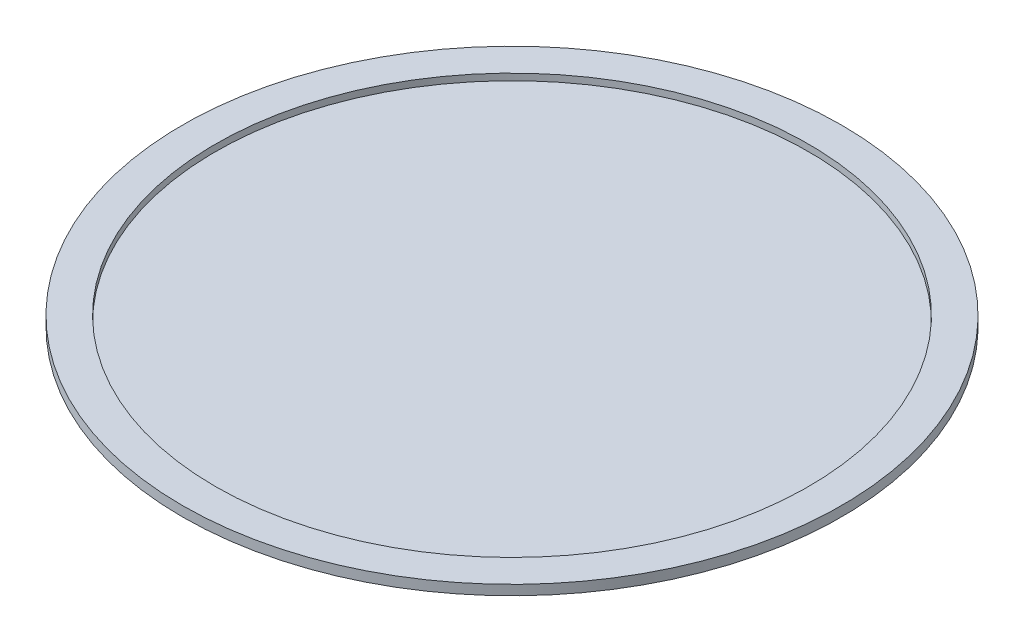
ISO-10303-21;
HEADER;
FILE_DESCRIPTION(('STEP AP214'),'2;1');
FILE_NAME('part.step','',(''),(''),'','','');
FILE_SCHEMA(('AUTOMOTIVE_DESIGN { 1 0 10303 214 1 1 1 1 }'));
ENDSEC;
DATA;
#1=APPLICATION_CONTEXT('core data for automotive mechanical design processes');
#2=APPLICATION_PROTOCOL_DEFINITION('international standard','automotive_design',2000,#1);
#3=PRODUCT_CONTEXT('',#1,'mechanical');
#4=PRODUCT('Part','Part','',(#3));
#5=PRODUCT_RELATED_PRODUCT_CATEGORY('part','',(#4));
#6=PRODUCT_DEFINITION_FORMATION('','',#4);
#7=PRODUCT_DEFINITION_CONTEXT('part definition',#1,'design');
#8=PRODUCT_DEFINITION('design','',#6,#7);
#9=PRODUCT_DEFINITION_SHAPE('','',#8);
#10=(LENGTH_UNIT() NAMED_UNIT(*) SI_UNIT(.MILLI.,.METRE.));
#11=(NAMED_UNIT(*) PLANE_ANGLE_UNIT() SI_UNIT($,.RADIAN.));
#12=(NAMED_UNIT(*) SI_UNIT($,.STERADIAN.) SOLID_ANGLE_UNIT());
#13=UNCERTAINTY_MEASURE_WITH_UNIT(LENGTH_MEASURE(1.E-05),#10,'distance_accuracy_value','');
#14=(GEOMETRIC_REPRESENTATION_CONTEXT(3) GLOBAL_UNCERTAINTY_ASSIGNED_CONTEXT((#13)) GLOBAL_UNIT_ASSIGNED_CONTEXT((#10,
#11,#12)) REPRESENTATION_CONTEXT('',''));
#15=CARTESIAN_POINT('',(0.,0.,0.));
#16=DIRECTION('',(0.,0.,1.));
#17=DIRECTION('',(1.,0.,0.));
#18=AXIS2_PLACEMENT_3D('',#15,#16,#17);
#19=CARTESIAN_POINT('',(0.,3.,0.));
#20=DIRECTION('',(0.,-1.,0.));
#21=DIRECTION('',(0.,0.,-1.));
#22=AXIS2_PLACEMENT_3D('',#19,#20,#21);
#23=CYLINDRICAL_SURFACE('',#22,100.);
#24=CARTESIAN_POINT('',(0.,3.,0.));
#25=DIRECTION('',(0.,1.,0.));
#26=DIRECTION('',(0.,0.,1.));
#27=AXIS2_PLACEMENT_3D('',#24,#25,#26);
#28=CIRCLE('',#27,100.);
#29=CARTESIAN_POINT('',(0.,3.,100.));
#30=VERTEX_POINT('',#29);
#31=EDGE_CURVE('E10',#30,#30,#28,.T.);
#32=ORIENTED_EDGE('',*,*,#31,.F.);
#33=EDGE_LOOP('',(#32));
#34=FACE_BOUND('',#33,.T.);
#35=CARTESIAN_POINT('',(0.,0.,0.));
#36=DIRECTION('',(0.,1.,0.));
#37=DIRECTION('',(0.,0.,1.));
#38=AXIS2_PLACEMENT_3D('',#35,#36,#37);
#39=CIRCLE('',#38,100.);
#40=CARTESIAN_POINT('',(0.,0.,100.));
#41=VERTEX_POINT('',#40);
#42=EDGE_CURVE('E34',#41,#41,#39,.T.);
#43=ORIENTED_EDGE('',*,*,#42,.T.);
#44=EDGE_LOOP('',(#43));
#45=FACE_BOUND('',#44,.T.);
#46=ADVANCED_FACE('F31',(#34,#45),#23,.T.);
#47=CARTESIAN_POINT('',(0.,3.,0.));
#48=DIRECTION('',(0.,1.,0.));
#49=DIRECTION('',(0.,0.,1.));
#50=AXIS2_PLACEMENT_3D('',#47,#48,#49);
#51=PLANE('',#50);
#52=CARTESIAN_POINT('',(0.,3.,0.));
#53=DIRECTION('',(0.,1.,0.));
#54=DIRECTION('',(0.,0.,1.));
#55=AXIS2_PLACEMENT_3D('',#52,#53,#54);
#56=CIRCLE('',#55,90.);
#57=CARTESIAN_POINT('',(0.,3.,90.));
#58=VERTEX_POINT('',#57);
#59=EDGE_CURVE('E43',#58,#58,#56,.T.);
#60=ORIENTED_EDGE('',*,*,#59,.F.);
#61=EDGE_LOOP('',(#60));
#62=FACE_BOUND('',#61,.T.);
#63=ORIENTED_EDGE('',*,*,#31,.T.);
#64=EDGE_LOOP('',(#63));
#65=FACE_BOUND('',#64,.T.);
#66=ADVANCED_FACE('F58',(#62,#65),#51,.T.);
#67=CARTESIAN_POINT('',(0.,0.,0.));
#68=DIRECTION('',(0.,1.,0.));
#69=DIRECTION('',(0.,0.,1.));
#70=AXIS2_PLACEMENT_3D('',#67,#68,#69);
#71=PLANE('',#70);
#72=ORIENTED_EDGE('',*,*,#42,.F.);
#73=EDGE_LOOP('',(#72));
#74=FACE_BOUND('',#73,.T.);
#75=ADVANCED_FACE('F54',(#74),#71,.F.);
#76=CARTESIAN_POINT('',(0.,1.,0.));
#77=DIRECTION('',(0.,1.,0.));
#78=DIRECTION('',(0.,0.,1.));
#79=AXIS2_PLACEMENT_3D('',#76,#77,#78);
#80=CYLINDRICAL_SURFACE('',#79,90.);
#81=CARTESIAN_POINT('',(0.,1.,0.));
#82=DIRECTION('',(0.,1.,0.));
#83=DIRECTION('',(0.,0.,1.));
#84=AXIS2_PLACEMENT_3D('',#81,#82,#83);
#85=CIRCLE('',#84,90.);
#86=CARTESIAN_POINT('',(0.,1.,90.));
#87=VERTEX_POINT('',#86);
#88=EDGE_CURVE('E41',#87,#87,#85,.T.);
#89=ORIENTED_EDGE('',*,*,#88,.F.);
#90=EDGE_LOOP('',(#89));
#91=FACE_BOUND('',#90,.T.);
#92=ORIENTED_EDGE('',*,*,#59,.T.);
#93=EDGE_LOOP('',(#92));
#94=FACE_BOUND('',#93,.T.);
#95=ADVANCED_FACE('F51',(#91,#94),#80,.F.);
#96=CARTESIAN_POINT('',(0.,1.,0.));
#97=DIRECTION('',(0.,1.,0.));
#98=DIRECTION('',(0.,0.,1.));
#99=AXIS2_PLACEMENT_3D('',#96,#97,#98);
#100=PLANE('',#99);
#101=ORIENTED_EDGE('',*,*,#88,.T.);
#102=EDGE_LOOP('',(#101));
#103=FACE_BOUND('',#102,.T.);
#104=ADVANCED_FACE('F49',(#103),#100,.T.);
#105=CLOSED_SHELL('',(#46,#66,#75,#95,#104));
#106=MANIFOLD_SOLID_BREP('B2',#105);
#107=ADVANCED_BREP_SHAPE_REPRESENTATION('',(#18,#106),#14);
#108=SHAPE_DEFINITION_REPRESENTATION(#9,#107);
ENDSEC;
END-ISO-10303-21;
